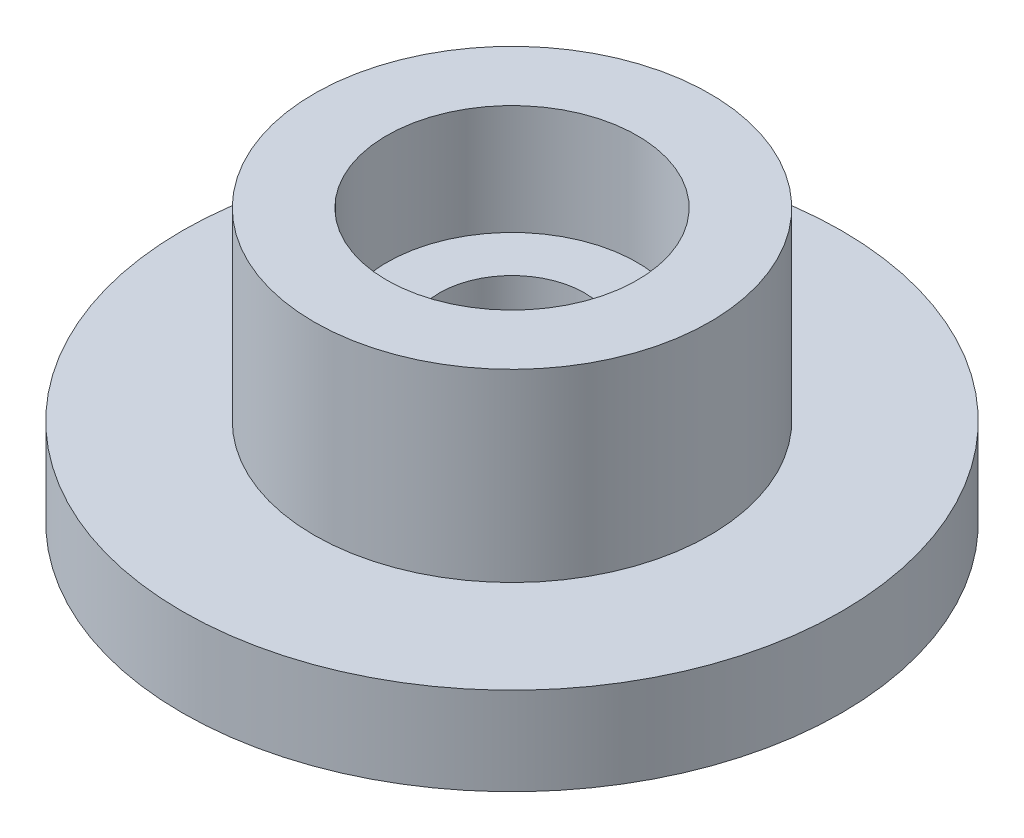
ISO-10303-21;
HEADER;
FILE_DESCRIPTION(('STEP AP214'),'2;1');
FILE_NAME('part.step','',(''),(''),'','','');
FILE_SCHEMA(('AUTOMOTIVE_DESIGN { 1 0 10303 214 1 1 1 1 }'));
ENDSEC;
DATA;
#1=APPLICATION_CONTEXT('core data for automotive mechanical design processes');
#2=APPLICATION_PROTOCOL_DEFINITION('international standard','automotive_design',2000,#1);
#3=PRODUCT_CONTEXT('',#1,'mechanical');
#4=PRODUCT('Part','Part','',(#3));
#5=PRODUCT_RELATED_PRODUCT_CATEGORY('part','',(#4));
#6=PRODUCT_DEFINITION_FORMATION('','',#4);
#7=PRODUCT_DEFINITION_CONTEXT('part definition',#1,'design');
#8=PRODUCT_DEFINITION('design','',#6,#7);
#9=PRODUCT_DEFINITION_SHAPE('','',#8);
#10=(LENGTH_UNIT() NAMED_UNIT(*) SI_UNIT(.MILLI.,.METRE.));
#11=(NAMED_UNIT(*) PLANE_ANGLE_UNIT() SI_UNIT($,.RADIAN.));
#12=(NAMED_UNIT(*) SI_UNIT($,.STERADIAN.) SOLID_ANGLE_UNIT());
#13=UNCERTAINTY_MEASURE_WITH_UNIT(LENGTH_MEASURE(1.E-05),#10,'distance_accuracy_value','');
#14=(GEOMETRIC_REPRESENTATION_CONTEXT(3) GLOBAL_UNCERTAINTY_ASSIGNED_CONTEXT((#13)) GLOBAL_UNIT_ASSIGNED_CONTEXT((#10,
#11,#12)) REPRESENTATION_CONTEXT('',''));
#15=CARTESIAN_POINT('',(0.,0.,0.));
#16=DIRECTION('',(0.,0.,1.));
#17=DIRECTION('',(1.,0.,0.));
#18=AXIS2_PLACEMENT_3D('',#15,#16,#17);
#19=CARTESIAN_POINT('',(0.,2.,0.));
#20=DIRECTION('',(0.,-1.,0.));
#21=DIRECTION('',(0.,0.,-1.));
#22=AXIS2_PLACEMENT_3D('',#19,#20,#21);
#23=CYLINDRICAL_SURFACE('',#22,7.5);
#24=CARTESIAN_POINT('',(0.,2.,0.));
#25=DIRECTION('',(0.,1.,0.));
#26=DIRECTION('',(0.,0.,1.));
#27=AXIS2_PLACEMENT_3D('',#24,#25,#26);
#28=CIRCLE('',#27,7.5);
#29=CARTESIAN_POINT('',(0.,2.,7.5));
#30=VERTEX_POINT('',#29);
#31=EDGE_CURVE('E42',#30,#30,#28,.T.);
#32=ORIENTED_EDGE('',*,*,#31,.F.);
#33=EDGE_LOOP('',(#32));
#34=FACE_BOUND('',#33,.T.);
#35=CARTESIAN_POINT('',(0.,0.,0.));
#36=DIRECTION('',(0.,1.,0.));
#37=DIRECTION('',(0.,0.,1.));
#38=AXIS2_PLACEMENT_3D('',#35,#36,#37);
#39=CIRCLE('',#38,7.5);
#40=CARTESIAN_POINT('',(0.,0.,7.5));
#41=VERTEX_POINT('',#40);
#42=EDGE_CURVE('E46',#41,#41,#39,.T.);
#43=ORIENTED_EDGE('',*,*,#42,.T.);
#44=EDGE_LOOP('',(#43));
#45=FACE_BOUND('',#44,.T.);
#46=ADVANCED_FACE('F35',(#34,#45),#23,.T.);
#47=CARTESIAN_POINT('',(0.,2.,0.));
#48=DIRECTION('',(0.,1.,0.));
#49=DIRECTION('',(0.,0.,1.));
#50=AXIS2_PLACEMENT_3D('',#47,#48,#49);
#51=PLANE('',#50);
#52=CARTESIAN_POINT('',(0.,2.,0.));
#53=DIRECTION('',(0.,1.,0.));
#54=DIRECTION('',(0.,0.,1.));
#55=AXIS2_PLACEMENT_3D('',#52,#53,#54);
#56=CIRCLE('',#55,4.5);
#57=CARTESIAN_POINT('',(0.,2.,4.5));
#58=VERTEX_POINT('',#57);
#59=EDGE_CURVE('E52',#58,#58,#56,.T.);
#60=ORIENTED_EDGE('',*,*,#59,.F.);
#61=EDGE_LOOP('',(#60));
#62=FACE_BOUND('',#61,.T.);
#63=ORIENTED_EDGE('',*,*,#31,.T.);
#64=EDGE_LOOP('',(#63));
#65=FACE_BOUND('',#64,.T.);
#66=ADVANCED_FACE('F84',(#62,#65),#51,.T.);
#67=CARTESIAN_POINT('',(0.,0.,0.));
#68=DIRECTION('',(0.,1.,0.));
#69=DIRECTION('',(0.,0.,1.));
#70=AXIS2_PLACEMENT_3D('',#67,#68,#69);
#71=PLANE('',#70);
#72=CARTESIAN_POINT('',(0.,0.,0.));
#73=DIRECTION('',(0.,-1.,0.));
#74=DIRECTION('',(0.,0.,-1.));
#75=AXIS2_PLACEMENT_3D('',#72,#73,#74);
#76=CIRCLE('',#75,1.65);
#77=CARTESIAN_POINT('',(0.,0.,-1.65));
#78=VERTEX_POINT('',#77);
#79=EDGE_CURVE('E60',#78,#78,#76,.T.);
#80=ORIENTED_EDGE('',*,*,#79,.F.);
#81=EDGE_LOOP('',(#80));
#82=FACE_BOUND('',#81,.T.);
#83=ORIENTED_EDGE('',*,*,#42,.F.);
#84=EDGE_LOOP('',(#83));
#85=FACE_BOUND('',#84,.T.);
#86=ADVANCED_FACE('F89',(#82,#85),#71,.F.);
#87=CARTESIAN_POINT('',(0.,6.2,0.));
#88=DIRECTION('',(0.,1.,0.));
#89=DIRECTION('',(0.,0.,1.));
#90=AXIS2_PLACEMENT_3D('',#87,#88,#89);
#91=PLANE('',#90);
#92=CARTESIAN_POINT('',(0.,6.2,0.));
#93=DIRECTION('',(0.,1.,0.));
#94=DIRECTION('',(0.,0.,1.));
#95=AXIS2_PLACEMENT_3D('',#92,#93,#94);
#96=CIRCLE('',#95,4.5);
#97=CARTESIAN_POINT('',(0.,6.2,4.5));
#98=VERTEX_POINT('',#97);
#99=EDGE_CURVE('E50',#98,#98,#96,.T.);
#100=ORIENTED_EDGE('',*,*,#99,.T.);
#101=EDGE_LOOP('',(#100));
#102=FACE_BOUND('',#101,.T.);
#103=CARTESIAN_POINT('',(0.,6.2,0.));
#104=DIRECTION('',(0.,1.,0.));
#105=DIRECTION('',(0.,0.,1.));
#106=AXIS2_PLACEMENT_3D('',#103,#104,#105);
#107=CIRCLE('',#106,2.85);
#108=CARTESIAN_POINT('',(0.,6.2,2.85));
#109=VERTEX_POINT('',#108);
#110=EDGE_CURVE('E55',#109,#109,#107,.T.);
#111=ORIENTED_EDGE('',*,*,#110,.F.);
#112=EDGE_LOOP('',(#111));
#113=FACE_BOUND('',#112,.T.);
#114=ADVANCED_FACE('F96',(#102,#113),#91,.T.);
#115=CARTESIAN_POINT('',(0.,6.2,0.));
#116=DIRECTION('',(0.,-1.,0.));
#117=DIRECTION('',(0.,0.,-1.));
#118=AXIS2_PLACEMENT_3D('',#115,#116,#117);
#119=CYLINDRICAL_SURFACE('',#118,4.5);
#120=ORIENTED_EDGE('',*,*,#99,.F.);
#121=EDGE_LOOP('',(#120));
#122=FACE_BOUND('',#121,.T.);
#123=ORIENTED_EDGE('',*,*,#59,.T.);
#124=EDGE_LOOP('',(#123));
#125=FACE_BOUND('',#124,.T.);
#126=ADVANCED_FACE('F80',(#122,#125),#119,.T.);
#127=CARTESIAN_POINT('',(0.,6.2,0.));
#128=DIRECTION('',(0.,-1.,0.));
#129=DIRECTION('',(0.,0.,-1.));
#130=AXIS2_PLACEMENT_3D('',#127,#128,#129);
#131=CYLINDRICAL_SURFACE('',#130,2.85);
#132=CARTESIAN_POINT('',(0.,3.7,0.));
#133=DIRECTION('',(0.,1.,0.));
#134=DIRECTION('',(0.,0.,1.));
#135=AXIS2_PLACEMENT_3D('',#132,#133,#134);
#136=CIRCLE('',#135,2.85);
#137=CARTESIAN_POINT('',(0.,3.7,2.85));
#138=VERTEX_POINT('',#137);
#139=EDGE_CURVE('E10',#138,#138,#136,.T.);
#140=ORIENTED_EDGE('',*,*,#139,.F.);
#141=EDGE_LOOP('',(#140));
#142=FACE_BOUND('',#141,.T.);
#143=ORIENTED_EDGE('',*,*,#110,.T.);
#144=EDGE_LOOP('',(#143));
#145=FACE_BOUND('',#144,.T.);
#146=ADVANCED_FACE('F71',(#142,#145),#131,.F.);
#147=CARTESIAN_POINT('',(0.,3.7,0.));
#148=DIRECTION('',(0.,1.,0.));
#149=DIRECTION('',(0.,0.,1.));
#150=AXIS2_PLACEMENT_3D('',#147,#148,#149);
#151=PLANE('',#150);
#152=CARTESIAN_POINT('',(0.,3.7,0.));
#153=DIRECTION('',(0.,1.,0.));
#154=DIRECTION('',(0.,0.,1.));
#155=AXIS2_PLACEMENT_3D('',#152,#153,#154);
#156=CIRCLE('',#155,1.65);
#157=CARTESIAN_POINT('',(0.,3.7,1.65));
#158=VERTEX_POINT('',#157);
#159=EDGE_CURVE('E38',#158,#158,#156,.T.);
#160=ORIENTED_EDGE('',*,*,#159,.F.);
#161=EDGE_LOOP('',(#160));
#162=FACE_BOUND('',#161,.T.);
#163=ORIENTED_EDGE('',*,*,#139,.T.);
#164=EDGE_LOOP('',(#163));
#165=FACE_BOUND('',#164,.T.);
#166=ADVANCED_FACE('F69',(#162,#165),#151,.T.);
#167=CARTESIAN_POINT('',(0.,6.2,0.));
#168=DIRECTION('',(0.,-1.,0.));
#169=DIRECTION('',(0.,0.,-1.));
#170=AXIS2_PLACEMENT_3D('',#167,#168,#169);
#171=CYLINDRICAL_SURFACE('',#170,1.65);
#172=ORIENTED_EDGE('',*,*,#159,.T.);
#173=EDGE_LOOP('',(#172));
#174=FACE_BOUND('',#173,.T.);
#175=ORIENTED_EDGE('',*,*,#79,.T.);
#176=EDGE_LOOP('',(#175));
#177=FACE_BOUND('',#176,.T.);
#178=ADVANCED_FACE('F67',(#174,#177),#171,.F.);
#179=CLOSED_SHELL('',(#46,#66,#86,#114,#126,#146,#166,#178));
#180=MANIFOLD_SOLID_BREP('B2',#179);
#181=ADVANCED_BREP_SHAPE_REPRESENTATION('',(#18,#180),#14);
#182=SHAPE_DEFINITION_REPRESENTATION(#9,#181);
ENDSEC;
END-ISO-10303-21;
